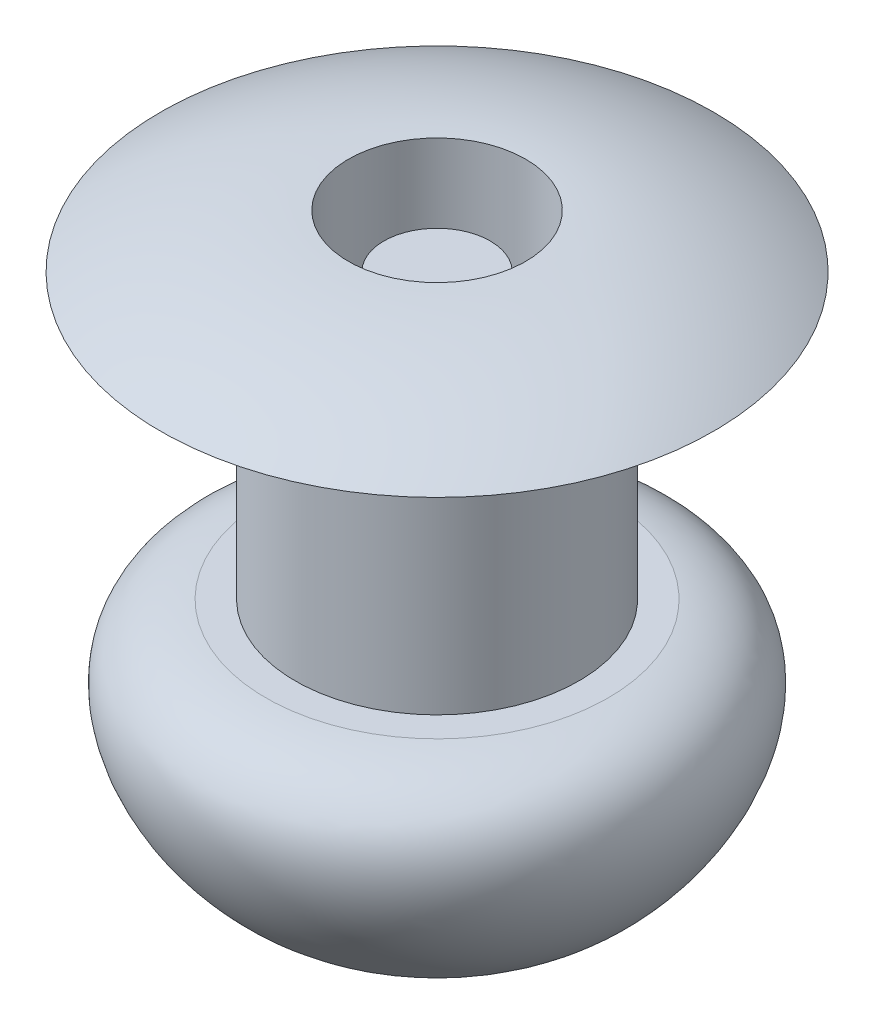
ISO-10303-21;
HEADER;
FILE_DESCRIPTION(('STEP AP214'),'2;1');
FILE_NAME('part.step','',(''),(''),'','','');
FILE_SCHEMA(('AUTOMOTIVE_DESIGN { 1 0 10303 214 1 1 1 1 }'));
ENDSEC;
DATA;
#1=APPLICATION_CONTEXT('core data for automotive mechanical design processes');
#2=APPLICATION_PROTOCOL_DEFINITION('international standard','automotive_design',2000,#1);
#3=PRODUCT_CONTEXT('',#1,'mechanical');
#4=PRODUCT('Part','Part','',(#3));
#5=PRODUCT_RELATED_PRODUCT_CATEGORY('part','',(#4));
#6=PRODUCT_DEFINITION_FORMATION('','',#4);
#7=PRODUCT_DEFINITION_CONTEXT('part definition',#1,'design');
#8=PRODUCT_DEFINITION('design','',#6,#7);
#9=PRODUCT_DEFINITION_SHAPE('','',#8);
#10=(LENGTH_UNIT() NAMED_UNIT(*) SI_UNIT(.MILLI.,.METRE.));
#11=(NAMED_UNIT(*) PLANE_ANGLE_UNIT() SI_UNIT($,.RADIAN.));
#12=(NAMED_UNIT(*) SI_UNIT($,.STERADIAN.) SOLID_ANGLE_UNIT());
#13=UNCERTAINTY_MEASURE_WITH_UNIT(LENGTH_MEASURE(1.E-05),#10,'distance_accuracy_value','');
#14=(GEOMETRIC_REPRESENTATION_CONTEXT(3) GLOBAL_UNCERTAINTY_ASSIGNED_CONTEXT((#13)) GLOBAL_UNIT_ASSIGNED_CONTEXT((#10,
#11,#12)) REPRESENTATION_CONTEXT('',''));
#15=CARTESIAN_POINT('',(0.,0.,0.));
#16=DIRECTION('',(0.,0.,1.));
#17=DIRECTION('',(1.,0.,0.));
#18=AXIS2_PLACEMENT_3D('',#15,#16,#17);
#19=CARTESIAN_POINT('',(0.,0.,0.));
#20=DIRECTION('',(0.,-1.,0.));
#21=DIRECTION('',(0.,0.,-1.));
#22=AXIS2_PLACEMENT_3D('',#19,#20,#21);
#23=PLANE('',#22);
#24=CARTESIAN_POINT('',(0.,0.,0.));
#25=DIRECTION('',(0.,-1.,0.));
#26=DIRECTION('',(0.,0.,-1.));
#27=AXIS2_PLACEMENT_3D('',#24,#25,#26);
#28=CIRCLE('',#27,0.75);
#29=CARTESIAN_POINT('',(0.,0.,-0.75));
#30=VERTEX_POINT('',#29);
#31=EDGE_CURVE('E11',#30,#30,#28,.T.);
#32=ORIENTED_EDGE('',*,*,#31,.F.);
#33=EDGE_LOOP('',(#32));
#34=FACE_BOUND('',#33,.T.);
#35=ADVANCED_FACE('F32',(#34),#23,.F.);
#36=CARTESIAN_POINT('',(0.,0.,0.));
#37=DIRECTION('',(0.,-1.,0.));
#38=DIRECTION('',(0.,0.,-1.));
#39=AXIS2_PLACEMENT_3D('',#36,#37,#38);
#40=CYLINDRICAL_SURFACE('',#39,0.75);
#41=CARTESIAN_POINT('',(0.,-4.20073852298997,0.));
#42=DIRECTION('',(0.,-1.,0.));
#43=DIRECTION('',(0.,0.,-1.));
#44=AXIS2_PLACEMENT_3D('',#41,#42,#43);
#45=CIRCLE('',#44,0.749999999999999);
#46=CARTESIAN_POINT('',(0.,-4.20073852298997,-0.749999999999999));
#47=VERTEX_POINT('',#46);
#48=EDGE_CURVE('E38',#47,#47,#45,.T.);
#49=ORIENTED_EDGE('',*,*,#48,.F.);
#50=EDGE_LOOP('',(#49));
#51=FACE_BOUND('',#50,.T.);
#52=ORIENTED_EDGE('',*,*,#31,.T.);
#53=EDGE_LOOP('',(#52));
#54=FACE_BOUND('',#53,.T.);
#55=ADVANCED_FACE('F77',(#51,#54),#40,.T.);
#56=CARTESIAN_POINT('',(0.,-4.20073852298997,0.749999999999999));
#57=DIRECTION('',(0.,-1.,0.));
#58=DIRECTION('',(0.,0.,-1.));
#59=AXIS2_PLACEMENT_3D('',#56,#57,#58);
#60=PLANE('',#59);
#61=CARTESIAN_POINT('',(0.,-4.20073852298997,0.));
#62=DIRECTION('',(0.,-1.,0.));
#63=DIRECTION('',(0.,0.,-1.));
#64=AXIS2_PLACEMENT_3D('',#61,#62,#63);
#65=CIRCLE('',#64,1.25);
#66=CARTESIAN_POINT('',(0.,-4.20073852298997,-1.25));
#67=VERTEX_POINT('',#66);
#68=EDGE_CURVE('E70',#67,#67,#65,.T.);
#69=ORIENTED_EDGE('',*,*,#68,.F.);
#70=EDGE_LOOP('',(#69));
#71=FACE_BOUND('',#70,.T.);
#72=ORIENTED_EDGE('',*,*,#48,.T.);
#73=EDGE_LOOP('',(#72));
#74=FACE_BOUND('',#73,.T.);
#75=ADVANCED_FACE('F75',(#71,#74),#60,.F.);
#76=CARTESIAN_POINT('',(0.,0.,0.));
#77=DIRECTION('',(0.,-1.,0.));
#78=DIRECTION('',(0.,0.,-1.));
#79=AXIS2_PLACEMENT_3D('',#76,#77,#78);
#80=CYLINDRICAL_SURFACE('',#79,1.25);
#81=CARTESIAN_POINT('',(0.,0.75,0.));
#82=DIRECTION('',(0.,-1.,0.));
#83=DIRECTION('',(0.,0.,-1.));
#84=AXIS2_PLACEMENT_3D('',#81,#82,#83);
#85=CIRCLE('',#84,1.25);
#86=CARTESIAN_POINT('',(0.,0.75,-1.25));
#87=VERTEX_POINT('',#86);
#88=EDGE_CURVE('E67',#87,#87,#85,.T.);
#89=ORIENTED_EDGE('',*,*,#88,.F.);
#90=EDGE_LOOP('',(#89));
#91=FACE_BOUND('',#90,.T.);
#92=ORIENTED_EDGE('',*,*,#68,.T.);
#93=EDGE_LOOP('',(#92));
#94=FACE_BOUND('',#93,.T.);
#95=ADVANCED_FACE('F95',(#91,#94),#80,.F.);
#96=CARTESIAN_POINT('',(0.,-4.30666666666667,0.));
#97=DIRECTION('',(0.,-1.,0.));
#98=DIRECTION('',(0.,0.,-1.));
#99=AXIS2_PLACEMENT_3D('',#96,#97,#98);
#100=DEGENERATE_TOROIDAL_SURFACE('',#99,1.25,5.05666666666667,.T.);
#101=CARTESIAN_POINT('',(0.,0.,0.));
#102=DIRECTION('',(0.,-1.,0.));
#103=DIRECTION('',(0.,0.,-1.));
#104=AXIS2_PLACEMENT_3D('',#101,#102,#103);
#105=CIRCLE('',#104,3.9);
#106=CARTESIAN_POINT('',(0.,0.,-3.9));
#107=VERTEX_POINT('',#106);
#108=EDGE_CURVE('E64',#107,#107,#105,.T.);
#109=ORIENTED_EDGE('',*,*,#108,.F.);
#110=EDGE_LOOP('',(#109));
#111=FACE_BOUND('',#110,.T.);
#112=ORIENTED_EDGE('',*,*,#88,.T.);
#113=EDGE_LOOP('',(#112));
#114=FACE_BOUND('',#113,.T.);
#115=ADVANCED_FACE('F103',(#111,#114),#100,.T.);
#116=CARTESIAN_POINT('',(0.,0.,3.9));
#117=DIRECTION('',(0.,1.,0.));
#118=DIRECTION('',(0.,0.,1.));
#119=AXIS2_PLACEMENT_3D('',#116,#117,#118);
#120=PLANE('',#119);
#121=CARTESIAN_POINT('',(0.,0.,0.));
#122=DIRECTION('',(0.,-1.,0.));
#123=DIRECTION('',(0.,0.,-1.));
#124=AXIS2_PLACEMENT_3D('',#121,#122,#123);
#125=CIRCLE('',#124,2.);
#126=CARTESIAN_POINT('',(0.,0.,-2.));
#127=VERTEX_POINT('',#126);
#128=EDGE_CURVE('E61',#127,#127,#125,.T.);
#129=ORIENTED_EDGE('',*,*,#128,.F.);
#130=EDGE_LOOP('',(#129));
#131=FACE_BOUND('',#130,.T.);
#132=ORIENTED_EDGE('',*,*,#108,.T.);
#133=EDGE_LOOP('',(#132));
#134=FACE_BOUND('',#133,.T.);
#135=ADVANCED_FACE('F111',(#131,#134),#120,.F.);
#136=CARTESIAN_POINT('',(0.,0.,0.));
#137=DIRECTION('',(0.,-1.,0.));
#138=DIRECTION('',(0.,0.,-1.));
#139=AXIS2_PLACEMENT_3D('',#136,#137,#138);
#140=CYLINDRICAL_SURFACE('',#139,2.);
#141=CARTESIAN_POINT('',(0.,-4.,0.));
#142=DIRECTION('',(0.,-1.,0.));
#143=DIRECTION('',(0.,0.,-1.));
#144=AXIS2_PLACEMENT_3D('',#141,#142,#143);
#145=CIRCLE('',#144,2.);
#146=CARTESIAN_POINT('',(0.,-4.,-2.));
#147=VERTEX_POINT('',#146);
#148=EDGE_CURVE('E53',#147,#147,#145,.T.);
#149=ORIENTED_EDGE('',*,*,#148,.F.);
#150=EDGE_LOOP('',(#149));
#151=FACE_BOUND('',#150,.T.);
#152=ORIENTED_EDGE('',*,*,#128,.T.);
#153=EDGE_LOOP('',(#152));
#154=FACE_BOUND('',#153,.T.);
#155=ADVANCED_FACE('F119',(#151,#154),#140,.T.);
#156=CARTESIAN_POINT('',(0.,-4.,2.));
#157=DIRECTION('',(0.,-1.,0.));
#158=DIRECTION('',(0.,0.,-1.));
#159=AXIS2_PLACEMENT_3D('',#156,#157,#158);
#160=PLANE('',#159);
#161=CARTESIAN_POINT('',(0.,-4.,0.));
#162=DIRECTION('',(0.,-1.,0.));
#163=DIRECTION('',(0.,0.,-1.));
#164=AXIS2_PLACEMENT_3D('',#161,#162,#163);
#165=CIRCLE('',#164,2.4138917546613);
#166=CARTESIAN_POINT('',(0.,-4.,-2.4138917546613));
#167=VERTEX_POINT('',#166);
#168=EDGE_CURVE('E50',#167,#167,#165,.T.);
#169=ORIENTED_EDGE('',*,*,#168,.F.);
#170=EDGE_LOOP('',(#169));
#171=FACE_BOUND('',#170,.T.);
#172=ORIENTED_EDGE('',*,*,#148,.T.);
#173=EDGE_LOOP('',(#172));
#174=FACE_BOUND('',#173,.T.);
#175=ADVANCED_FACE('F127',(#171,#174),#160,.F.);
#176=CARTESIAN_POINT('',(0.,-4.,2.4138917546613));
#177=CARTESIAN_POINT('',(0.,-4.16965732172857,3.86750311174021));
#178=CARTESIAN_POINT('',(0.,-6.30201362643837,3.52887764908681));
#179=CARTESIAN_POINT('',(0.,-7.87353236883243,1.08396164238539));
#180=CARTESIAN_POINT('',(0.,-5.87494929761665,0.271752617549607));
#181=CARTESIAN_POINT('',(0.,-5.57892919358065,0.956030426512504));
#182=B_SPLINE_CURVE_WITH_KNOTS('',3,(#176,#177,#178,#179,#180,#181),.UNSPECIFIED.,.F.,.F.,(4,1,
1,4),(0.,0.464993081764921,0.721927552661067,1.),.UNSPECIFIED.);
#183=CARTESIAN_POINT('',(0.,0.,0.));
#184=DIRECTION('',(0.,-1.,0.));
#185=AXIS1_PLACEMENT('',#183,#184);
#186=SURFACE_OF_REVOLUTION('',#182,#185);
#187=CARTESIAN_POINT('',(0.,-5.57892919358065,0.));
#188=DIRECTION('',(0.,-1.,0.));
#189=DIRECTION('',(0.,0.,-1.));
#190=AXIS2_PLACEMENT_3D('',#187,#188,#189);
#191=CIRCLE('',#190,0.956030426512504);
#192=CARTESIAN_POINT('',(0.,-5.57892919358065,-0.956030426512504));
#193=VERTEX_POINT('',#192);
#194=EDGE_CURVE('E48',#193,#193,#191,.T.);
#195=ORIENTED_EDGE('',*,*,#194,.F.);
#196=EDGE_LOOP('',(#195));
#197=FACE_BOUND('',#196,.T.);
#198=ORIENTED_EDGE('',*,*,#168,.T.);
#199=EDGE_LOOP('',(#198));
#200=FACE_BOUND('',#199,.T.);
#201=ADVANCED_FACE('F44',(#197,#200),#186,.T.);
#202=CARTESIAN_POINT('',(0.,-4.95073852298997,0.));
#203=DIRECTION('',(1.,0.,0.));
#204=DIRECTION('',(0.,0.,1.));
#205=AXIS2_PLACEMENT_3D('',#202,#203,#204);
#206=ELLIPSE('',#205,1.75,0.75);
#207=TRIMMED_CURVE('',#206,(PARAMETER_VALUE(-1.5707963267949)),
(PARAMETER_VALUE(1.5707963267949)),.T.,.PARAMETER.);
#208=CARTESIAN_POINT('',(0.,0.,0.));
#209=DIRECTION('',(0.,-1.,0.));
#210=AXIS1_PLACEMENT('',#208,#209);
#211=SURFACE_OF_REVOLUTION('',#207,#210);
#212=CARTESIAN_POINT('',(0.,-5.70073852298997,0.));
#213=VERTEX_POINT('',#212);
#214=VERTEX_LOOP('',#213);
#215=FACE_BOUND('',#214,.T.);
#216=ORIENTED_EDGE('',*,*,#194,.T.);
#217=EDGE_LOOP('',(#216));
#218=FACE_BOUND('',#217,.T.);
#219=ADVANCED_FACE('F41',(#215,#218),#211,.T.);
#220=CLOSED_SHELL('',(#35,#55,#75,#95,#115,#135,#155,#175,#201,#219));
#221=MANIFOLD_SOLID_BREP('B2',#220);
#222=ADVANCED_BREP_SHAPE_REPRESENTATION('',(#18,#221),#14);
#223=SHAPE_DEFINITION_REPRESENTATION(#9,#222);
ENDSEC;
END-ISO-10303-21;
